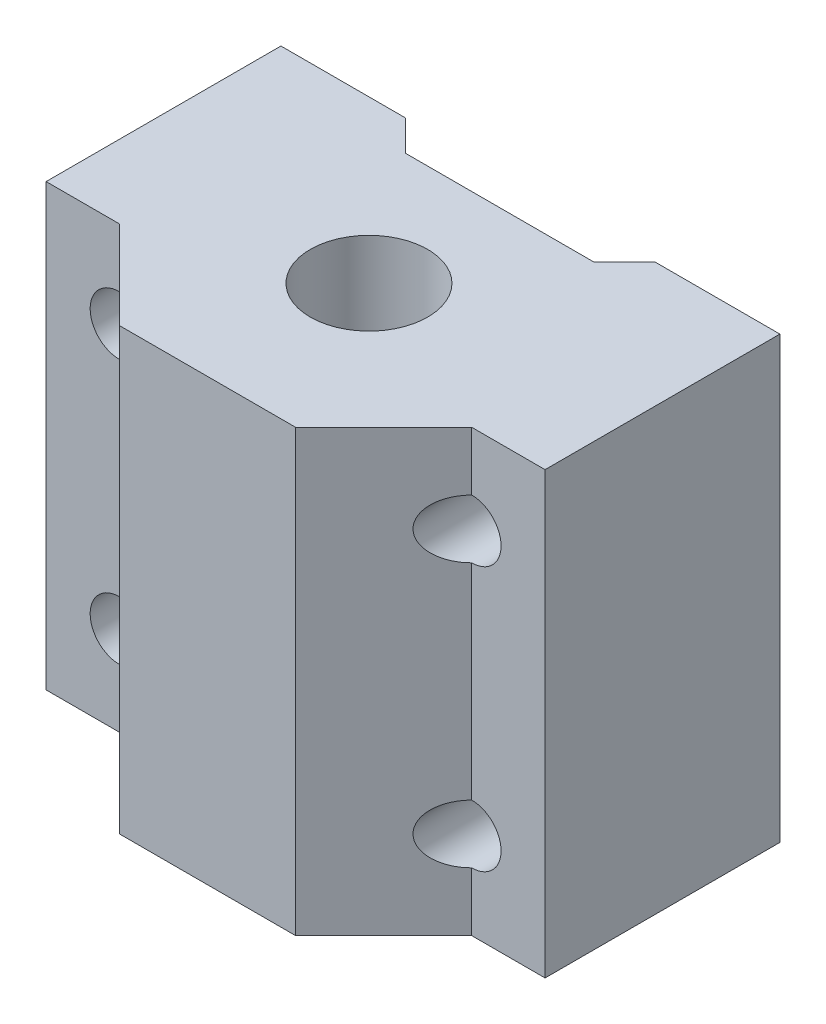
ISO-10303-21;
HEADER;
FILE_DESCRIPTION(('STEP AP214'),'2;1');
FILE_NAME('part.step','',(''),(''),'','','');
FILE_SCHEMA(('AUTOMOTIVE_DESIGN { 1 0 10303 214 1 1 1 1 }'));
ENDSEC;
DATA;
#1=APPLICATION_CONTEXT('core data for automotive mechanical design processes');
#2=APPLICATION_PROTOCOL_DEFINITION('international standard','automotive_design',2000,#1);
#3=PRODUCT_CONTEXT('',#1,'mechanical');
#4=PRODUCT('Part','Part','',(#3));
#5=PRODUCT_RELATED_PRODUCT_CATEGORY('part','',(#4));
#6=PRODUCT_DEFINITION_FORMATION('','',#4);
#7=PRODUCT_DEFINITION_CONTEXT('part definition',#1,'design');
#8=PRODUCT_DEFINITION('design','',#6,#7);
#9=PRODUCT_DEFINITION_SHAPE('','',#8);
#10=(LENGTH_UNIT() NAMED_UNIT(*) SI_UNIT(.MILLI.,.METRE.));
#11=(NAMED_UNIT(*) PLANE_ANGLE_UNIT() SI_UNIT($,.RADIAN.));
#12=(NAMED_UNIT(*) SI_UNIT($,.STERADIAN.) SOLID_ANGLE_UNIT());
#13=UNCERTAINTY_MEASURE_WITH_UNIT(LENGTH_MEASURE(1.E-05),#10,'distance_accuracy_value','');
#14=(GEOMETRIC_REPRESENTATION_CONTEXT(3) GLOBAL_UNCERTAINTY_ASSIGNED_CONTEXT((#13)) GLOBAL_UNIT_ASSIGNED_CONTEXT((#10,
#11,#12)) REPRESENTATION_CONTEXT('',''));
#15=CARTESIAN_POINT('',(0.,0.,0.));
#16=DIRECTION('',(0.,0.,1.));
#17=DIRECTION('',(1.,0.,0.));
#18=AXIS2_PLACEMENT_3D('',#15,#16,#17);
#19=CARTESIAN_POINT('',(0.,0.,0.));
#20=DIRECTION('',(0.,0.,-1.));
#21=DIRECTION('',(-1.,0.,0.));
#22=AXIS2_PLACEMENT_3D('',#19,#20,#21);
#23=PLANE('',#22);
#24=DIRECTION('',(0.,1.,0.));
#25=VECTOR('',#24,1.);
#26=CARTESIAN_POINT('',(8.5000000000002,-15.,2.09488880425715E-13));
#27=LINE('',#26,#25);
#28=CARTESIAN_POINT('',(8.5000000000002,-15.,2.09488880425715E-13));
#29=VERTEX_POINT('',#28);
#30=CARTESIAN_POINT('',(8.5000000000002,15.,0.));
#31=VERTEX_POINT('',#30);
#32=EDGE_CURVE('E264',#29,#31,#27,.T.);
#33=ORIENTED_EDGE('',*,*,#32,.T.);
#34=DIRECTION('',(-1.,0.,0.));
#35=VECTOR('',#34,1.);
#36=CARTESIAN_POINT('',(-17.,15.,0.));
#37=LINE('',#36,#35);
#38=CARTESIAN_POINT('',(17.,15.,0.));
#39=VERTEX_POINT('',#38);
#40=EDGE_CURVE('E240',#39,#31,#37,.T.);
#41=ORIENTED_EDGE('',*,*,#40,.F.);
#42=DIRECTION('',(0.,1.,0.));
#43=VECTOR('',#42,1.);
#44=CARTESIAN_POINT('',(17.,-15.,0.));
#45=LINE('',#44,#43);
#46=CARTESIAN_POINT('',(17.,-15.,0.));
#47=VERTEX_POINT('',#46);
#48=EDGE_CURVE('E224',#47,#39,#45,.T.);
#49=ORIENTED_EDGE('',*,*,#48,.F.);
#50=DIRECTION('',(1.,0.,0.));
#51=VECTOR('',#50,1.);
#52=CARTESIAN_POINT('',(-17.,-15.,0.));
#53=LINE('',#52,#51);
#54=EDGE_CURVE('E244',#29,#47,#53,.T.);
#55=ORIENTED_EDGE('',*,*,#54,.F.);
#56=EDGE_LOOP('',(#33,#41,#49,#55));
#57=FACE_BOUND('',#56,.T.);
#58=CARTESIAN_POINT('',(12.,-9.00000000000001,0.));
#59=DIRECTION('',(0.,0.,1.));
#60=DIRECTION('',(1.,0.,0.));
#61=AXIS2_PLACEMENT_3D('',#58,#59,#60);
#62=CIRCLE('',#61,2.);
#63=CARTESIAN_POINT('',(14.,-9.00000000000001,0.));
#64=VERTEX_POINT('',#63);
#65=EDGE_CURVE('E227',#64,#64,#62,.T.);
#66=ORIENTED_EDGE('',*,*,#65,.T.);
#67=EDGE_LOOP('',(#66));
#68=FACE_BOUND('',#67,.T.);
#69=CARTESIAN_POINT('',(12.,8.99999999999999,0.));
#70=DIRECTION('',(0.,0.,1.));
#71=DIRECTION('',(1.,0.,0.));
#72=AXIS2_PLACEMENT_3D('',#69,#70,#71);
#73=CIRCLE('',#72,2.);
#74=CARTESIAN_POINT('',(14.,8.99999999999999,0.));
#75=VERTEX_POINT('',#74);
#76=EDGE_CURVE('E221',#75,#75,#73,.T.);
#77=ORIENTED_EDGE('',*,*,#76,.T.);
#78=EDGE_LOOP('',(#77));
#79=FACE_BOUND('',#78,.T.);
#80=ADVANCED_FACE('F43',(#57,#68,#79),#23,.T.);
#81=CARTESIAN_POINT('',(0.,0.,22.));
#82=DIRECTION('',(0.,0.,-1.));
#83=DIRECTION('',(-1.,0.,0.));
#84=AXIS2_PLACEMENT_3D('',#81,#82,#83);
#85=PLANE('',#84);
#86=DIRECTION('',(1.,0.,0.));
#87=VECTOR('',#86,1.);
#88=CARTESIAN_POINT('',(-17.,-15.,22.));
#89=LINE('',#88,#87);
#90=CARTESIAN_POINT('',(-5.99999999999981,-14.9999999999999,22.0000000000003));
#91=VERTEX_POINT('',#90);
#92=CARTESIAN_POINT('',(5.99999999999991,-14.9999999999999,22.0000000000003));
#93=VERTEX_POINT('',#92);
#94=EDGE_CURVE('E234',#91,#93,#89,.T.);
#95=ORIENTED_EDGE('',*,*,#94,.T.);
#96=DIRECTION('',(0.,1.,0.));
#97=VECTOR('',#96,1.);
#98=CARTESIAN_POINT('',(5.99999999999991,-14.9999999999999,22.0000000000003));
#99=LINE('',#98,#97);
#100=CARTESIAN_POINT('',(5.99999999999991,15.0000000000001,22.0000000000001));
#101=VERTEX_POINT('',#100);
#102=EDGE_CURVE('E296',#93,#101,#99,.T.);
#103=ORIENTED_EDGE('',*,*,#102,.T.);
#104=DIRECTION('',(-1.,0.,0.));
#105=VECTOR('',#104,1.);
#106=CARTESIAN_POINT('',(-17.,15.,22.));
#107=LINE('',#106,#105);
#108=CARTESIAN_POINT('',(-5.99999999999981,15.0000000000001,22.0000000000001));
#109=VERTEX_POINT('',#108);
#110=EDGE_CURVE('E231',#101,#109,#107,.T.);
#111=ORIENTED_EDGE('',*,*,#110,.T.);
#112=DIRECTION('',(0.,1.,0.));
#113=VECTOR('',#112,1.);
#114=CARTESIAN_POINT('',(-5.99999999999981,-14.9999999999999,22.0000000000003));
#115=LINE('',#114,#113);
#116=EDGE_CURVE('E208',#91,#109,#115,.T.);
#117=ORIENTED_EDGE('',*,*,#116,.F.);
#118=EDGE_LOOP('',(#95,#103,#111,#117));
#119=FACE_BOUND('',#118,.T.);
#120=ADVANCED_FACE('F335',(#119),#85,.F.);
#121=DIRECTION('',(0.,1.,0.));
#122=VECTOR('',#121,1.);
#123=CARTESIAN_POINT('',(-8.5,-15.,2.09488880115522E-13));
#124=LINE('',#123,#122);
#125=CARTESIAN_POINT('',(-8.5,-15.,2.09488880115522E-13));
#126=VERTEX_POINT('',#125);
#127=CARTESIAN_POINT('',(-8.5,15.,0.));
#128=VERTEX_POINT('',#127);
#129=EDGE_CURVE('E281',#126,#128,#124,.T.);
#130=ORIENTED_EDGE('',*,*,#129,.F.);
#131=CARTESIAN_POINT('',(-17.,-15.,0.));
#132=VERTEX_POINT('',#131);
#133=EDGE_CURVE('E235',#132,#126,#53,.T.);
#134=ORIENTED_EDGE('',*,*,#133,.F.);
#135=DIRECTION('',(0.,-1.,0.));
#136=VECTOR('',#135,1.);
#137=CARTESIAN_POINT('',(-17.,-15.,0.));
#138=LINE('',#137,#136);
#139=CARTESIAN_POINT('',(-17.,15.,0.));
#140=VERTEX_POINT('',#139);
#141=EDGE_CURVE('E242',#140,#132,#138,.T.);
#142=ORIENTED_EDGE('',*,*,#141,.F.);
#143=EDGE_CURVE('E184',#128,#140,#37,.T.);
#144=ORIENTED_EDGE('',*,*,#143,.F.);
#145=EDGE_LOOP('',(#130,#134,#142,#144));
#146=FACE_BOUND('',#145,.T.);
#147=CARTESIAN_POINT('',(-12.,8.99999999999999,0.));
#148=DIRECTION('',(0.,0.,1.));
#149=DIRECTION('',(1.,0.,0.));
#150=AXIS2_PLACEMENT_3D('',#147,#148,#149);
#151=CIRCLE('',#150,2.);
#152=CARTESIAN_POINT('',(-10.,8.99999999999999,0.));
#153=VERTEX_POINT('',#152);
#154=EDGE_CURVE('E220',#153,#153,#151,.T.);
#155=ORIENTED_EDGE('',*,*,#154,.T.);
#156=EDGE_LOOP('',(#155));
#157=FACE_BOUND('',#156,.T.);
#158=CARTESIAN_POINT('',(-12.,-9.00000000000001,0.));
#159=DIRECTION('',(0.,0.,1.));
#160=DIRECTION('',(1.,0.,0.));
#161=AXIS2_PLACEMENT_3D('',#158,#159,#160);
#162=CIRCLE('',#161,2.);
#163=CARTESIAN_POINT('',(-10.,-9.00000000000001,0.));
#164=VERTEX_POINT('',#163);
#165=EDGE_CURVE('E218',#164,#164,#162,.T.);
#166=ORIENTED_EDGE('',*,*,#165,.T.);
#167=EDGE_LOOP('',(#166));
#168=FACE_BOUND('',#167,.T.);
#169=ADVANCED_FACE('F337',(#146,#157,#168),#23,.T.);
#170=CARTESIAN_POINT('',(17.,-15.,22.));
#171=DIRECTION('',(-1.,0.,0.));
#172=DIRECTION('',(0.,0.,1.));
#173=AXIS2_PLACEMENT_3D('',#170,#171,#172);
#174=PLANE('',#173);
#175=DIRECTION('',(0.,0.,-1.));
#176=VECTOR('',#175,1.);
#177=CARTESIAN_POINT('',(17.,15.,22.));
#178=LINE('',#177,#176);
#179=CARTESIAN_POINT('',(17.,15.0000000000001,16.));
#180=VERTEX_POINT('',#179);
#181=EDGE_CURVE('E185',#180,#39,#178,.T.);
#182=ORIENTED_EDGE('',*,*,#181,.F.);
#183=DIRECTION('',(0.,1.,0.));
#184=VECTOR('',#183,1.);
#185=CARTESIAN_POINT('',(17.,-14.9999999999999,16.0000000000002));
#186=LINE('',#185,#184);
#187=CARTESIAN_POINT('',(17.,-14.9999999999999,16.0000000000002));
#188=VERTEX_POINT('',#187);
#189=EDGE_CURVE('E252',#188,#180,#186,.T.);
#190=ORIENTED_EDGE('',*,*,#189,.F.);
#191=DIRECTION('',(0.,0.,-1.));
#192=VECTOR('',#191,1.);
#193=CARTESIAN_POINT('',(17.,-15.,22.));
#194=LINE('',#193,#192);
#195=EDGE_CURVE('E189',#188,#47,#194,.T.);
#196=ORIENTED_EDGE('',*,*,#195,.T.);
#197=ORIENTED_EDGE('',*,*,#48,.T.);
#198=EDGE_LOOP('',(#182,#190,#196,#197));
#199=FACE_BOUND('',#198,.T.);
#200=ADVANCED_FACE('F45',(#199),#174,.F.);
#201=CARTESIAN_POINT('',(-17.,15.,22.));
#202=DIRECTION('',(0.,-1.,0.));
#203=DIRECTION('',(0.,0.,-1.));
#204=AXIS2_PLACEMENT_3D('',#201,#202,#203);
#205=PLANE('',#204);
#206=CARTESIAN_POINT('',(0.,15.,11.));
#207=DIRECTION('',(0.,1.,0.));
#208=DIRECTION('',(0.,0.,1.));
#209=AXIS2_PLACEMENT_3D('',#206,#207,#208);
#210=CIRCLE('',#209,4.);
#211=CARTESIAN_POINT('',(0.,15.0000000000001,15.));
#212=VERTEX_POINT('',#211);
#213=EDGE_CURVE('E305',#212,#212,#210,.T.);
#214=ORIENTED_EDGE('',*,*,#213,.F.);
#215=EDGE_LOOP('',(#214));
#216=FACE_BOUND('',#215,.T.);
#217=ORIENTED_EDGE('',*,*,#40,.T.);
#218=DIRECTION('',(0.707106781186581,0.,-0.707106781186514));
#219=VECTOR('',#218,1.);
#220=CARTESIAN_POINT('',(8.5000000000002,15.,0.));
#221=LINE('',#220,#219);
#222=CARTESIAN_POINT('',(6.41489781140652,15.,2.08510218859348));
#223=VERTEX_POINT('',#222);
#224=EDGE_CURVE('E267',#223,#31,#221,.T.);
#225=ORIENTED_EDGE('',*,*,#224,.F.);
#226=DIRECTION('',(1.,0.,0.));
#227=VECTOR('',#226,1.);
#228=CARTESIAN_POINT('',(-6.41489781140658,15.,2.08510218859347));
#229=LINE('',#228,#227);
#230=CARTESIAN_POINT('',(-6.41489781140658,15.,2.08510218859347));
#231=VERTEX_POINT('',#230);
#232=EDGE_CURVE('E289',#231,#223,#229,.T.);
#233=ORIENTED_EDGE('',*,*,#232,.F.);
#234=DIRECTION('',(0.707106781186538,0.,0.707106781186557));
#235=VECTOR('',#234,1.);
#236=CARTESIAN_POINT('',(-8.5,15.,0.));
#237=LINE('',#236,#235);
#238=EDGE_CURVE('E293',#128,#231,#237,.T.);
#239=ORIENTED_EDGE('',*,*,#238,.F.);
#240=ORIENTED_EDGE('',*,*,#143,.T.);
#241=DIRECTION('',(0.,0.,-1.));
#242=VECTOR('',#241,1.);
#243=CARTESIAN_POINT('',(-17.,15.,22.));
#244=LINE('',#243,#242);
#245=CARTESIAN_POINT('',(-17.,15.0000000000001,16.));
#246=VERTEX_POINT('',#245);
#247=EDGE_CURVE('E175',#246,#140,#244,.T.);
#248=ORIENTED_EDGE('',*,*,#247,.F.);
#249=DIRECTION('',(-1.,0.,0.));
#250=VECTOR('',#249,1.);
#251=CARTESIAN_POINT('',(-17.,15.0000000000001,16.));
#252=LINE('',#251,#250);
#253=CARTESIAN_POINT('',(-12.,15.0000000000001,16.));
#254=VERTEX_POINT('',#253);
#255=EDGE_CURVE('E156',#254,#246,#252,.T.);
#256=ORIENTED_EDGE('',*,*,#255,.F.);
#257=DIRECTION('',(-0.707106781186553,0.,-0.707106781186542));
#258=VECTOR('',#257,1.);
#259=CARTESIAN_POINT('',(-12.,15.0000000000001,16.));
#260=LINE('',#259,#258);
#261=EDGE_CURVE('E167',#109,#254,#260,.T.);
#262=ORIENTED_EDGE('',*,*,#261,.F.);
#263=ORIENTED_EDGE('',*,*,#110,.F.);
#264=DIRECTION('',(-0.707106781186547,0.,0.707106781186548));
#265=VECTOR('',#264,1.);
#266=CARTESIAN_POINT('',(12.,15.0000000000001,16.));
#267=LINE('',#266,#265);
#268=CARTESIAN_POINT('',(12.,15.0000000000001,16.));
#269=VERTEX_POINT('',#268);
#270=EDGE_CURVE('E272',#269,#101,#267,.T.);
#271=ORIENTED_EDGE('',*,*,#270,.F.);
#272=DIRECTION('',(-1.,0.,0.));
#273=VECTOR('',#272,1.);
#274=CARTESIAN_POINT('',(17.,15.0000000000001,16.));
#275=LINE('',#274,#273);
#276=EDGE_CURVE('E178',#180,#269,#275,.T.);
#277=ORIENTED_EDGE('',*,*,#276,.F.);
#278=ORIENTED_EDGE('',*,*,#181,.T.);
#279=EDGE_LOOP('',(#217,#225,#233,#239,#240,#248,#256,#262,#263,#271,#277,#278));
#280=FACE_BOUND('',#279,.T.);
#281=ADVANCED_FACE('F181',(#216,#280),#205,.F.);
#282=CARTESIAN_POINT('',(-17.,-15.,22.));
#283=DIRECTION('',(1.,0.,0.));
#284=DIRECTION('',(0.,0.,-1.));
#285=AXIS2_PLACEMENT_3D('',#282,#283,#284);
#286=PLANE('',#285);
#287=DIRECTION('',(0.,0.,-1.));
#288=VECTOR('',#287,1.);
#289=CARTESIAN_POINT('',(-17.,-15.,22.));
#290=LINE('',#289,#288);
#291=CARTESIAN_POINT('',(-17.,-14.9999999999999,16.0000000000002));
#292=VERTEX_POINT('',#291);
#293=EDGE_CURVE('E177',#292,#132,#290,.T.);
#294=ORIENTED_EDGE('',*,*,#293,.F.);
#295=DIRECTION('',(0.,1.,0.));
#296=VECTOR('',#295,1.);
#297=CARTESIAN_POINT('',(-17.,-14.9999999999999,16.0000000000002));
#298=LINE('',#297,#296);
#299=EDGE_CURVE('E160',#292,#246,#298,.T.);
#300=ORIENTED_EDGE('',*,*,#299,.T.);
#301=ORIENTED_EDGE('',*,*,#247,.T.);
#302=ORIENTED_EDGE('',*,*,#141,.T.);
#303=EDGE_LOOP('',(#294,#300,#301,#302));
#304=FACE_BOUND('',#303,.T.);
#305=ADVANCED_FACE('F173',(#304),#286,.F.);
#306=CARTESIAN_POINT('',(-17.,-15.,22.));
#307=DIRECTION('',(0.,1.,0.));
#308=DIRECTION('',(0.,0.,1.));
#309=AXIS2_PLACEMENT_3D('',#306,#307,#308);
#310=PLANE('',#309);
#311=CARTESIAN_POINT('',(0.,-15.,11.0000000000002));
#312=DIRECTION('',(0.,1.,0.));
#313=DIRECTION('',(0.,0.,1.));
#314=AXIS2_PLACEMENT_3D('',#311,#312,#313);
#315=CIRCLE('',#314,4.);
#316=CARTESIAN_POINT('',(0.,-14.9999999999999,15.0000000000002));
#317=VERTEX_POINT('',#316);
#318=EDGE_CURVE('E301',#317,#317,#315,.T.);
#319=ORIENTED_EDGE('',*,*,#318,.T.);
#320=EDGE_LOOP('',(#319));
#321=FACE_BOUND('',#320,.T.);
#322=DIRECTION('',(1.,0.,0.));
#323=VECTOR('',#322,1.);
#324=CARTESIAN_POINT('',(-6.41489781140658,-15.,2.08510218859368));
#325=LINE('',#324,#323);
#326=CARTESIAN_POINT('',(-6.41489781140658,-15.,2.08510218859368));
#327=VERTEX_POINT('',#326);
#328=CARTESIAN_POINT('',(6.41489781140652,-15.,2.08510218859369));
#329=VERTEX_POINT('',#328);
#330=EDGE_CURVE('E58',#327,#329,#325,.T.);
#331=ORIENTED_EDGE('',*,*,#330,.T.);
#332=DIRECTION('',(0.707106781186581,0.,-0.707106781186514));
#333=VECTOR('',#332,1.);
#334=CARTESIAN_POINT('',(8.5000000000002,-15.,2.09488880425715E-13));
#335=LINE('',#334,#333);
#336=EDGE_CURVE('E259',#329,#29,#335,.T.);
#337=ORIENTED_EDGE('',*,*,#336,.T.);
#338=ORIENTED_EDGE('',*,*,#54,.T.);
#339=ORIENTED_EDGE('',*,*,#195,.F.);
#340=DIRECTION('',(-1.,0.,0.));
#341=VECTOR('',#340,1.);
#342=CARTESIAN_POINT('',(17.,-14.9999999999999,16.0000000000002));
#343=LINE('',#342,#341);
#344=CARTESIAN_POINT('',(12.,-15.,16.0000000000002));
#345=VERTEX_POINT('',#344);
#346=EDGE_CURVE('E275',#188,#345,#343,.T.);
#347=ORIENTED_EDGE('',*,*,#346,.T.);
#348=DIRECTION('',(-0.707106781186547,0.,0.707106781186548));
#349=VECTOR('',#348,1.);
#350=CARTESIAN_POINT('',(12.,-14.9999999999999,16.0000000000002));
#351=LINE('',#350,#349);
#352=EDGE_CURVE('E66',#345,#93,#351,.T.);
#353=ORIENTED_EDGE('',*,*,#352,.T.);
#354=ORIENTED_EDGE('',*,*,#94,.F.);
#355=DIRECTION('',(-0.707106781186553,0.,-0.707106781186542));
#356=VECTOR('',#355,1.);
#357=CARTESIAN_POINT('',(-12.,-14.9999999999999,16.0000000000002));
#358=LINE('',#357,#356);
#359=CARTESIAN_POINT('',(-12.,-15.,16.0000000000002));
#360=VERTEX_POINT('',#359);
#361=EDGE_CURVE('E168',#91,#360,#358,.T.);
#362=ORIENTED_EDGE('',*,*,#361,.T.);
#363=DIRECTION('',(-1.,0.,0.));
#364=VECTOR('',#363,1.);
#365=CARTESIAN_POINT('',(-17.,-14.9999999999999,16.0000000000002));
#366=LINE('',#365,#364);
#367=EDGE_CURVE('E207',#360,#292,#366,.T.);
#368=ORIENTED_EDGE('',*,*,#367,.T.);
#369=ORIENTED_EDGE('',*,*,#293,.T.);
#370=ORIENTED_EDGE('',*,*,#133,.T.);
#371=DIRECTION('',(0.707106781186538,0.,0.707106781186557));
#372=VECTOR('',#371,1.);
#373=CARTESIAN_POINT('',(-8.5,-15.,2.09488880115522E-13));
#374=LINE('',#373,#372);
#375=EDGE_CURVE('E290',#126,#327,#374,.T.);
#376=ORIENTED_EDGE('',*,*,#375,.T.);
#377=EDGE_LOOP('',(#331,#337,#338,#339,#347,#353,#354,#362,#368,#369,#370,#376));
#378=FACE_BOUND('',#377,.T.);
#379=ADVANCED_FACE('F257',(#321,#378),#310,.F.);
#380=CARTESIAN_POINT('',(-12.,8.99999999999999,22.));
#381=DIRECTION('',(0.,0.,-1.));
#382=DIRECTION('',(-1.,0.,0.));
#383=AXIS2_PLACEMENT_3D('',#380,#381,#382);
#384=CYLINDRICAL_SURFACE('',#383,2.);
#385=CARTESIAN_POINT('',(-12.,8.99999999999999,16.));
#386=DIRECTION('',(0.,0.,-1.));
#387=DIRECTION('',(0.,1.,0.));
#388=AXIS2_PLACEMENT_3D('',#385,#386,#387);
#389=CIRCLE('',#388,2.);
#390=CARTESIAN_POINT('',(-12.,6.99999999999999,16.0000000000001));
#391=VERTEX_POINT('',#390);
#392=CARTESIAN_POINT('',(-12.,11.,16.));
#393=VERTEX_POINT('',#392);
#394=EDGE_CURVE('E314',#391,#393,#389,.T.);
#395=ORIENTED_EDGE('',*,*,#394,.F.);
#396=CARTESIAN_POINT('',(-12.,8.99999999999999,16.));
#397=DIRECTION('',(0.707106781186542,0.,-0.707106781186553));
#398=DIRECTION('',(-0.707106781186553,0.,-0.707106781186542));
#399=AXIS2_PLACEMENT_3D('',#396,#397,#398);
#400=ELLIPSE('',#399,2.82842712474617,2.);
#401=EDGE_CURVE('E312',#393,#391,#400,.T.);
#402=ORIENTED_EDGE('',*,*,#401,.F.);
#403=EDGE_LOOP('',(#395,#402));
#404=FACE_BOUND('',#403,.T.);
#405=ORIENTED_EDGE('',*,*,#154,.F.);
#406=EDGE_LOOP('',(#405));
#407=FACE_BOUND('',#406,.T.);
#408=ADVANCED_FACE('F214',(#404,#407),#384,.F.);
#409=CARTESIAN_POINT('',(-12.,-9.00000000000001,22.));
#410=DIRECTION('',(0.,0.,-1.));
#411=DIRECTION('',(-1.,0.,0.));
#412=AXIS2_PLACEMENT_3D('',#409,#410,#411);
#413=CYLINDRICAL_SURFACE('',#412,2.);
#414=CARTESIAN_POINT('',(-12.,-9.00000000000001,16.0000000000002));
#415=DIRECTION('',(0.,0.,-1.));
#416=DIRECTION('',(0.,1.,0.));
#417=AXIS2_PLACEMENT_3D('',#414,#415,#416);
#418=CIRCLE('',#417,2.);
#419=CARTESIAN_POINT('',(-12.,-11.,16.0000000000002));
#420=VERTEX_POINT('',#419);
#421=CARTESIAN_POINT('',(-12.,-7.00000000000001,16.0000000000002));
#422=VERTEX_POINT('',#421);
#423=EDGE_CURVE('E11',#420,#422,#418,.T.);
#424=ORIENTED_EDGE('',*,*,#423,.F.);
#425=CARTESIAN_POINT('',(-12.,-9.00000000000001,16.0000000000002));
#426=DIRECTION('',(0.707106781186542,0.,-0.707106781186553));
#427=DIRECTION('',(-0.707106781186553,0.,-0.707106781186542));
#428=AXIS2_PLACEMENT_3D('',#425,#426,#427);
#429=ELLIPSE('',#428,2.82842712474617,2.);
#430=EDGE_CURVE('E51',#422,#420,#429,.T.);
#431=ORIENTED_EDGE('',*,*,#430,.F.);
#432=EDGE_LOOP('',(#424,#431));
#433=FACE_BOUND('',#432,.T.);
#434=ORIENTED_EDGE('',*,*,#165,.F.);
#435=EDGE_LOOP('',(#434));
#436=FACE_BOUND('',#435,.T.);
#437=ADVANCED_FACE('F210',(#433,#436),#413,.F.);
#438=CARTESIAN_POINT('',(12.,8.99999999999999,22.));
#439=DIRECTION('',(0.,0.,-1.));
#440=DIRECTION('',(-1.,0.,0.));
#441=AXIS2_PLACEMENT_3D('',#438,#439,#440);
#442=CYLINDRICAL_SURFACE('',#441,2.);
#443=CARTESIAN_POINT('',(12.,8.99999999999999,16.));
#444=DIRECTION('',(-0.707106781186548,0.,-0.707106781186547));
#445=DIRECTION('',(0.707106781186547,0.,-0.707106781186548));
#446=AXIS2_PLACEMENT_3D('',#443,#444,#445);
#447=ELLIPSE('',#446,2.82842712474619,2.);
#448=CARTESIAN_POINT('',(12.,6.99999999999999,16.0000000000001));
#449=VERTEX_POINT('',#448);
#450=CARTESIAN_POINT('',(12.,11.,16.));
#451=VERTEX_POINT('',#450);
#452=EDGE_CURVE('E309',#449,#451,#447,.T.);
#453=ORIENTED_EDGE('',*,*,#452,.F.);
#454=CARTESIAN_POINT('',(12.,8.99999999999999,16.));
#455=DIRECTION('',(0.,0.,-1.));
#456=DIRECTION('',(0.,1.,0.));
#457=AXIS2_PLACEMENT_3D('',#454,#455,#456);
#458=CIRCLE('',#457,2.);
#459=EDGE_CURVE('E304',#451,#449,#458,.T.);
#460=ORIENTED_EDGE('',*,*,#459,.F.);
#461=EDGE_LOOP('',(#453,#460));
#462=FACE_BOUND('',#461,.T.);
#463=ORIENTED_EDGE('',*,*,#76,.F.);
#464=EDGE_LOOP('',(#463));
#465=FACE_BOUND('',#464,.T.);
#466=ADVANCED_FACE('F213',(#462,#465),#442,.F.);
#467=CARTESIAN_POINT('',(12.,-9.00000000000001,22.));
#468=DIRECTION('',(0.,0.,-1.));
#469=DIRECTION('',(-1.,0.,0.));
#470=AXIS2_PLACEMENT_3D('',#467,#468,#469);
#471=CYLINDRICAL_SURFACE('',#470,2.);
#472=CARTESIAN_POINT('',(12.,-9.00000000000001,16.0000000000002));
#473=DIRECTION('',(-0.707106781186548,0.,-0.707106781186547));
#474=DIRECTION('',(0.707106781186547,0.,-0.707106781186548));
#475=AXIS2_PLACEMENT_3D('',#472,#473,#474);
#476=ELLIPSE('',#475,2.82842712474619,2.);
#477=CARTESIAN_POINT('',(12.,-11.,16.0000000000002));
#478=VERTEX_POINT('',#477);
#479=CARTESIAN_POINT('',(12.,-7.00000000000001,16.0000000000002));
#480=VERTEX_POINT('',#479);
#481=EDGE_CURVE('E194',#478,#480,#476,.T.);
#482=ORIENTED_EDGE('',*,*,#481,.F.);
#483=CARTESIAN_POINT('',(12.,-9.00000000000001,16.0000000000002));
#484=DIRECTION('',(0.,0.,-1.));
#485=DIRECTION('',(0.,1.,0.));
#486=AXIS2_PLACEMENT_3D('',#483,#484,#485);
#487=CIRCLE('',#486,2.);
#488=EDGE_CURVE('E187',#480,#478,#487,.T.);
#489=ORIENTED_EDGE('',*,*,#488,.F.);
#490=EDGE_LOOP('',(#482,#489));
#491=FACE_BOUND('',#490,.T.);
#492=ORIENTED_EDGE('',*,*,#65,.F.);
#493=EDGE_LOOP('',(#492));
#494=FACE_BOUND('',#493,.T.);
#495=ADVANCED_FACE('F319',(#491,#494),#471,.F.);
#496=CARTESIAN_POINT('',(12.,-14.9999999999999,16.0000000000002));
#497=DIRECTION('',(-0.707106781186548,0.,-0.707106781186547));
#498=DIRECTION('',(-0.707106781186547,0.,0.707106781186548));
#499=AXIS2_PLACEMENT_3D('',#496,#497,#498);
#500=PLANE('',#499);
#501=ORIENTED_EDGE('',*,*,#452,.T.);
#502=DIRECTION('',(0.,1.,0.));
#503=VECTOR('',#502,1.);
#504=CARTESIAN_POINT('',(12.,-14.9999999999999,16.0000000000002));
#505=LINE('',#504,#503);
#506=EDGE_CURVE('E371',#451,#269,#505,.T.);
#507=ORIENTED_EDGE('',*,*,#506,.T.);
#508=ORIENTED_EDGE('',*,*,#270,.T.);
#509=ORIENTED_EDGE('',*,*,#102,.F.);
#510=ORIENTED_EDGE('',*,*,#352,.F.);
#511=EDGE_CURVE('E369',#345,#478,#505,.T.);
#512=ORIENTED_EDGE('',*,*,#511,.T.);
#513=ORIENTED_EDGE('',*,*,#481,.T.);
#514=EDGE_CURVE('E370',#480,#449,#505,.T.);
#515=ORIENTED_EDGE('',*,*,#514,.T.);
#516=EDGE_LOOP('',(#501,#507,#508,#509,#510,#512,#513,#515));
#517=FACE_BOUND('',#516,.T.);
#518=ADVANCED_FACE('F321',(#517),#500,.F.);
#519=CARTESIAN_POINT('',(17.,-14.9999999999999,16.0000000000002));
#520=DIRECTION('',(0.,0.,-1.));
#521=DIRECTION('',(0.,1.,0.));
#522=AXIS2_PLACEMENT_3D('',#519,#520,#521);
#523=PLANE('',#522);
#524=ORIENTED_EDGE('',*,*,#459,.T.);
#525=ORIENTED_EDGE('',*,*,#514,.F.);
#526=ORIENTED_EDGE('',*,*,#488,.T.);
#527=ORIENTED_EDGE('',*,*,#511,.F.);
#528=ORIENTED_EDGE('',*,*,#346,.F.);
#529=ORIENTED_EDGE('',*,*,#189,.T.);
#530=ORIENTED_EDGE('',*,*,#276,.T.);
#531=ORIENTED_EDGE('',*,*,#506,.F.);
#532=EDGE_LOOP('',(#524,#525,#526,#527,#528,#529,#530,#531));
#533=FACE_BOUND('',#532,.T.);
#534=ADVANCED_FACE('F328',(#533),#523,.F.);
#535=CARTESIAN_POINT('',(-17.,-14.9999999999999,16.0000000000002));
#536=DIRECTION('',(0.,0.,-1.));
#537=DIRECTION('',(0.,1.,0.));
#538=AXIS2_PLACEMENT_3D('',#535,#536,#537);
#539=PLANE('',#538);
#540=ORIENTED_EDGE('',*,*,#394,.T.);
#541=DIRECTION('',(0.,1.,0.));
#542=VECTOR('',#541,1.);
#543=CARTESIAN_POINT('',(-12.,-14.9999999999999,16.0000000000002));
#544=LINE('',#543,#542);
#545=EDGE_CURVE('E162',#393,#254,#544,.T.);
#546=ORIENTED_EDGE('',*,*,#545,.T.);
#547=ORIENTED_EDGE('',*,*,#255,.T.);
#548=ORIENTED_EDGE('',*,*,#299,.F.);
#549=ORIENTED_EDGE('',*,*,#367,.F.);
#550=EDGE_CURVE('E201',#360,#420,#544,.T.);
#551=ORIENTED_EDGE('',*,*,#550,.T.);
#552=ORIENTED_EDGE('',*,*,#423,.T.);
#553=EDGE_CURVE('E204',#422,#391,#544,.T.);
#554=ORIENTED_EDGE('',*,*,#553,.T.);
#555=EDGE_LOOP('',(#540,#546,#547,#548,#549,#551,#552,#554));
#556=FACE_BOUND('',#555,.T.);
#557=ADVANCED_FACE('F159',(#556),#539,.F.);
#558=CARTESIAN_POINT('',(-12.,-14.9999999999999,16.0000000000002));
#559=DIRECTION('',(0.707106781186542,0.,-0.707106781186553));
#560=DIRECTION('',(-0.707106781186553,0.,-0.707106781186542));
#561=AXIS2_PLACEMENT_3D('',#558,#559,#560);
#562=PLANE('',#561);
#563=ORIENTED_EDGE('',*,*,#401,.T.);
#564=ORIENTED_EDGE('',*,*,#553,.F.);
#565=ORIENTED_EDGE('',*,*,#430,.T.);
#566=ORIENTED_EDGE('',*,*,#550,.F.);
#567=ORIENTED_EDGE('',*,*,#361,.F.);
#568=ORIENTED_EDGE('',*,*,#116,.T.);
#569=ORIENTED_EDGE('',*,*,#261,.T.);
#570=ORIENTED_EDGE('',*,*,#545,.F.);
#571=EDGE_LOOP('',(#563,#564,#565,#566,#567,#568,#569,#570));
#572=FACE_BOUND('',#571,.T.);
#573=ADVANCED_FACE('F200',(#572),#562,.F.);
#574=CARTESIAN_POINT('',(0.,-15.,11.0000000000002));
#575=DIRECTION('',(0.,1.,0.));
#576=DIRECTION('',(0.,0.,1.));
#577=AXIS2_PLACEMENT_3D('',#574,#575,#576);
#578=CYLINDRICAL_SURFACE('',#577,4.);
#579=ORIENTED_EDGE('',*,*,#318,.F.);
#580=EDGE_LOOP('',(#579));
#581=FACE_BOUND('',#580,.T.);
#582=ORIENTED_EDGE('',*,*,#213,.T.);
#583=EDGE_LOOP('',(#582));
#584=FACE_BOUND('',#583,.T.);
#585=ADVANCED_FACE('F395',(#581,#584),#578,.F.);
#586=CARTESIAN_POINT('',(8.5000000000002,-15.,2.09488880425715E-13));
#587=DIRECTION('',(0.707106781186514,0.,0.707106781186581));
#588=DIRECTION('',(0.707106781186581,0.,-0.707106781186514));
#589=AXIS2_PLACEMENT_3D('',#586,#587,#588);
#590=PLANE('',#589);
#591=ORIENTED_EDGE('',*,*,#224,.T.);
#592=ORIENTED_EDGE('',*,*,#32,.F.);
#593=ORIENTED_EDGE('',*,*,#336,.F.);
#594=DIRECTION('',(0.,1.,0.));
#595=VECTOR('',#594,1.);
#596=CARTESIAN_POINT('',(6.41489781140652,-15.,2.08510218859369));
#597=LINE('',#596,#595);
#598=EDGE_CURVE('E285',#329,#223,#597,.T.);
#599=ORIENTED_EDGE('',*,*,#598,.T.);
#600=EDGE_LOOP('',(#591,#592,#593,#599));
#601=FACE_BOUND('',#600,.T.);
#602=ADVANCED_FACE('F393',(#601),#590,.F.);
#603=CARTESIAN_POINT('',(-6.41489781140658,-15.,2.08510218859368));
#604=DIRECTION('',(0.,0.,1.));
#605=DIRECTION('',(0.,-1.,0.));
#606=AXIS2_PLACEMENT_3D('',#603,#604,#605);
#607=PLANE('',#606);
#608=ORIENTED_EDGE('',*,*,#232,.T.);
#609=ORIENTED_EDGE('',*,*,#598,.F.);
#610=ORIENTED_EDGE('',*,*,#330,.F.);
#611=DIRECTION('',(0.,1.,0.));
#612=VECTOR('',#611,1.);
#613=CARTESIAN_POINT('',(-6.41489781140658,-15.,2.08510218859368));
#614=LINE('',#613,#612);
#615=EDGE_CURVE('E283',#327,#231,#614,.T.);
#616=ORIENTED_EDGE('',*,*,#615,.T.);
#617=EDGE_LOOP('',(#608,#609,#610,#616));
#618=FACE_BOUND('',#617,.T.);
#619=ADVANCED_FACE('F389',(#618),#607,.F.);
#620=CARTESIAN_POINT('',(-8.5,-15.,2.09488880115522E-13));
#621=DIRECTION('',(-0.707106781186557,0.,0.707106781186538));
#622=DIRECTION('',(0.707106781186538,0.,0.707106781186557));
#623=AXIS2_PLACEMENT_3D('',#620,#621,#622);
#624=PLANE('',#623);
#625=ORIENTED_EDGE('',*,*,#238,.T.);
#626=ORIENTED_EDGE('',*,*,#615,.F.);
#627=ORIENTED_EDGE('',*,*,#375,.F.);
#628=ORIENTED_EDGE('',*,*,#129,.T.);
#629=EDGE_LOOP('',(#625,#626,#627,#628));
#630=FACE_BOUND('',#629,.T.);
#631=ADVANCED_FACE('F386',(#630),#624,.F.);
#632=CLOSED_SHELL('',(#80,#120,#169,#200,#281,#305,#379,#408,#437,#466,#495,#518,#534,#557,#573,
#585,#602,#619,#631));
#633=MANIFOLD_SOLID_BREP('B2',#632);
#634=ADVANCED_BREP_SHAPE_REPRESENTATION('',(#18,#633),#14);
#635=SHAPE_DEFINITION_REPRESENTATION(#9,#634);
ENDSEC;
END-ISO-10303-21;
